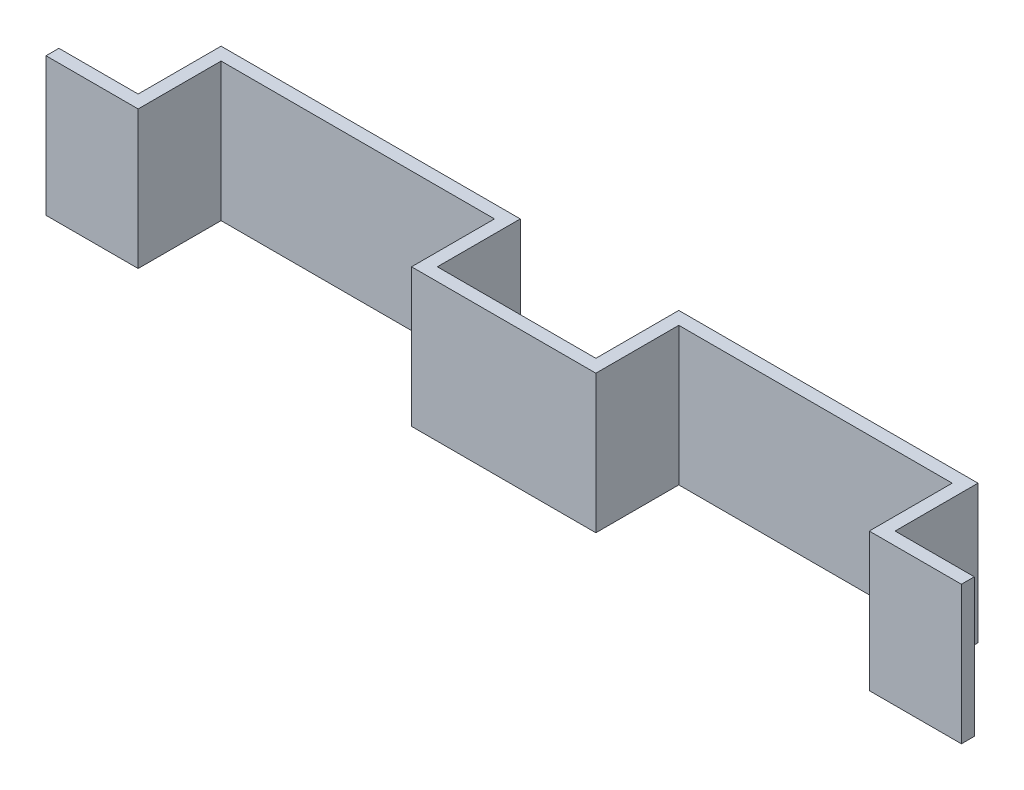
ISO-10303-21;
HEADER;
FILE_DESCRIPTION(('STEP AP214'),'2;1');
FILE_NAME('part.step','',(''),(''),'','','');
FILE_SCHEMA(('AUTOMOTIVE_DESIGN { 1 0 10303 214 1 1 1 1 }'));
ENDSEC;
DATA;
#1=APPLICATION_CONTEXT('core data for automotive mechanical design processes');
#2=APPLICATION_PROTOCOL_DEFINITION('international standard','automotive_design',2000,#1);
#3=PRODUCT_CONTEXT('',#1,'mechanical');
#4=PRODUCT('Part','Part','',(#3));
#5=PRODUCT_RELATED_PRODUCT_CATEGORY('part','',(#4));
#6=PRODUCT_DEFINITION_FORMATION('','',#4);
#7=PRODUCT_DEFINITION_CONTEXT('part definition',#1,'design');
#8=PRODUCT_DEFINITION('design','',#6,#7);
#9=PRODUCT_DEFINITION_SHAPE('','',#8);
#10=(LENGTH_UNIT() NAMED_UNIT(*) SI_UNIT(.MILLI.,.METRE.));
#11=(NAMED_UNIT(*) PLANE_ANGLE_UNIT() SI_UNIT($,.RADIAN.));
#12=(NAMED_UNIT(*) SI_UNIT($,.STERADIAN.) SOLID_ANGLE_UNIT());
#13=UNCERTAINTY_MEASURE_WITH_UNIT(LENGTH_MEASURE(1.E-05),#10,'distance_accuracy_value','');
#14=(GEOMETRIC_REPRESENTATION_CONTEXT(3) GLOBAL_UNCERTAINTY_ASSIGNED_CONTEXT((#13)) GLOBAL_UNIT_ASSIGNED_CONTEXT((#10,
#11,#12)) REPRESENTATION_CONTEXT('',''));
#15=CARTESIAN_POINT('',(0.,0.,0.));
#16=DIRECTION('',(0.,0.,1.));
#17=DIRECTION('',(1.,0.,0.));
#18=AXIS2_PLACEMENT_3D('',#15,#16,#17);
#19=CARTESIAN_POINT('',(0.,15.,0.));
#20=DIRECTION('',(0.,0.,-1.));
#21=DIRECTION('',(-1.,0.,0.));
#22=AXIS2_PLACEMENT_3D('',#19,#20,#21);
#23=PLANE('',#22);
#24=DIRECTION('',(1.,0.,0.));
#25=VECTOR('',#24,1.);
#26=CARTESIAN_POINT('',(0.,0.,0.));
#27=LINE('',#26,#25);
#28=CARTESIAN_POINT('',(-32.4699999999999,0.,0.));
#29=VERTEX_POINT('',#28);
#30=CARTESIAN_POINT('',(0.,0.,0.));
#31=VERTEX_POINT('',#30);
#32=EDGE_CURVE('E206',#29,#31,#27,.T.);
#33=ORIENTED_EDGE('',*,*,#32,.F.);
#34=DIRECTION('',(0.,-1.,0.));
#35=VECTOR('',#34,1.);
#36=CARTESIAN_POINT('',(-32.4699999999999,15.,0.));
#37=LINE('',#36,#35);
#38=CARTESIAN_POINT('',(-32.4699999999999,15.,0.));
#39=VERTEX_POINT('',#38);
#40=EDGE_CURVE('E11',#39,#29,#37,.T.);
#41=ORIENTED_EDGE('',*,*,#40,.F.);
#42=DIRECTION('',(1.,0.,0.));
#43=VECTOR('',#42,1.);
#44=CARTESIAN_POINT('',(0.,15.,0.));
#45=LINE('',#44,#43);
#46=CARTESIAN_POINT('',(0.,15.,0.));
#47=VERTEX_POINT('',#46);
#48=EDGE_CURVE('E265',#39,#47,#45,.T.);
#49=ORIENTED_EDGE('',*,*,#48,.T.);
#50=DIRECTION('',(0.,-1.,0.));
#51=VECTOR('',#50,1.);
#52=CARTESIAN_POINT('',(0.,15.,0.));
#53=LINE('',#52,#51);
#54=EDGE_CURVE('E60',#47,#31,#53,.T.);
#55=ORIENTED_EDGE('',*,*,#54,.T.);
#56=EDGE_LOOP('',(#33,#41,#49,#55));
#57=FACE_BOUND('',#56,.T.);
#58=ADVANCED_FACE('F41',(#57),#23,.T.);
#59=CARTESIAN_POINT('',(-32.4699999999999,15.,1.7523791060211E-13));
#60=DIRECTION('',(-1.,0.,0.));
#61=DIRECTION('',(0.,0.,1.));
#62=AXIS2_PLACEMENT_3D('',#59,#60,#61);
#63=PLANE('',#62);
#64=DIRECTION('',(0.,0.,-1.));
#65=VECTOR('',#64,1.);
#66=CARTESIAN_POINT('',(-32.4699999999999,0.,1.7523791060211E-13));
#67=LINE('',#66,#65);
#68=CARTESIAN_POINT('',(-32.4699999999999,0.,9.00000000000046));
#69=VERTEX_POINT('',#68);
#70=EDGE_CURVE('E208',#69,#29,#67,.T.);
#71=ORIENTED_EDGE('',*,*,#70,.F.);
#72=DIRECTION('',(0.,-1.,0.));
#73=VECTOR('',#72,1.);
#74=CARTESIAN_POINT('',(-32.4699999999999,15.,9.00000000000046));
#75=LINE('',#74,#73);
#76=CARTESIAN_POINT('',(-32.4699999999999,15.,9.00000000000046));
#77=VERTEX_POINT('',#76);
#78=EDGE_CURVE('E47',#77,#69,#75,.T.);
#79=ORIENTED_EDGE('',*,*,#78,.F.);
#80=DIRECTION('',(0.,0.,-1.));
#81=VECTOR('',#80,1.);
#82=CARTESIAN_POINT('',(-32.4699999999999,15.,1.7523791060211E-13));
#83=LINE('',#82,#81);
#84=EDGE_CURVE('E312',#77,#39,#83,.T.);
#85=ORIENTED_EDGE('',*,*,#84,.T.);
#86=ORIENTED_EDGE('',*,*,#40,.T.);
#87=EDGE_LOOP('',(#71,#79,#85,#86));
#88=FACE_BOUND('',#87,.T.);
#89=ADVANCED_FACE('F302',(#88),#63,.T.);
#90=CARTESIAN_POINT('',(1.27078580216906E-13,15.,9.));
#91=DIRECTION('',(0.,0.,-1.));
#92=DIRECTION('',(-1.,0.,0.));
#93=AXIS2_PLACEMENT_3D('',#90,#91,#92);
#94=PLANE('',#93);
#95=DIRECTION('',(1.,0.,0.));
#96=VECTOR('',#95,1.);
#97=CARTESIAN_POINT('',(1.27078580216906E-13,0.,9.));
#98=LINE('',#97,#96);
#99=CARTESIAN_POINT('',(-49.6699999999999,0.,9.00000000000069));
#100=VERTEX_POINT('',#99);
#101=EDGE_CURVE('E211',#100,#69,#98,.T.);
#102=ORIENTED_EDGE('',*,*,#101,.F.);
#103=DIRECTION('',(0.,-1.,0.));
#104=VECTOR('',#103,1.);
#105=CARTESIAN_POINT('',(-49.6699999999999,15.,9.00000000000069));
#106=LINE('',#105,#104);
#107=CARTESIAN_POINT('',(-49.6699999999999,15.,9.00000000000069));
#108=VERTEX_POINT('',#107);
#109=EDGE_CURVE('E295',#108,#100,#106,.T.);
#110=ORIENTED_EDGE('',*,*,#109,.F.);
#111=DIRECTION('',(1.,0.,0.));
#112=VECTOR('',#111,1.);
#113=CARTESIAN_POINT('',(1.27078580216906E-13,15.,9.));
#114=LINE('',#113,#112);
#115=EDGE_CURVE('E298',#108,#77,#114,.T.);
#116=ORIENTED_EDGE('',*,*,#115,.T.);
#117=ORIENTED_EDGE('',*,*,#78,.T.);
#118=EDGE_LOOP('',(#102,#110,#116,#117));
#119=FACE_BOUND('',#118,.T.);
#120=ADVANCED_FACE('F296',(#119),#94,.T.);
#121=CARTESIAN_POINT('',(-49.67,15.,3.0635987573962E-13));
#122=DIRECTION('',(1.,0.,0.));
#123=DIRECTION('',(0.,0.,-1.));
#124=AXIS2_PLACEMENT_3D('',#121,#122,#123);
#125=PLANE('',#124);
#126=DIRECTION('',(0.,0.,1.));
#127=VECTOR('',#126,1.);
#128=CARTESIAN_POINT('',(-49.67,0.,3.0635987573962E-13));
#129=LINE('',#128,#127);
#130=CARTESIAN_POINT('',(-49.67,0.,6.9368751520493E-13));
#131=VERTEX_POINT('',#130);
#132=EDGE_CURVE('E212',#131,#100,#129,.T.);
#133=ORIENTED_EDGE('',*,*,#132,.F.);
#134=DIRECTION('',(0.,-1.,0.));
#135=VECTOR('',#134,1.);
#136=CARTESIAN_POINT('',(-49.67,15.,6.9368751520493E-13));
#137=LINE('',#136,#135);
#138=CARTESIAN_POINT('',(-49.67,15.,6.9368751520493E-13));
#139=VERTEX_POINT('',#138);
#140=EDGE_CURVE('E289',#139,#131,#137,.T.);
#141=ORIENTED_EDGE('',*,*,#140,.F.);
#142=DIRECTION('',(0.,0.,1.));
#143=VECTOR('',#142,1.);
#144=CARTESIAN_POINT('',(-49.67,15.,3.0635987573962E-13));
#145=LINE('',#144,#143);
#146=EDGE_CURVE('E315',#139,#108,#145,.T.);
#147=ORIENTED_EDGE('',*,*,#146,.T.);
#148=ORIENTED_EDGE('',*,*,#109,.T.);
#149=EDGE_LOOP('',(#133,#141,#147,#148));
#150=FACE_BOUND('',#149,.T.);
#151=ADVANCED_FACE('F310',(#150),#125,.T.);
#152=CARTESIAN_POINT('',(0.,15.,7.41453045845511E-13));
#153=DIRECTION('',(0.,0.,-1.));
#154=DIRECTION('',(-1.,0.,0.));
#155=AXIS2_PLACEMENT_3D('',#152,#153,#154);
#156=PLANE('',#155);
#157=DIRECTION('',(1.,0.,0.));
#158=VECTOR('',#157,1.);
#159=CARTESIAN_POINT('',(0.,0.,7.41453045845511E-13));
#160=LINE('',#159,#158);
#161=CARTESIAN_POINT('',(-82.1399999999999,0.,6.62462489833772E-13));
#162=VERTEX_POINT('',#161);
#163=EDGE_CURVE('E220',#162,#131,#160,.T.);
#164=ORIENTED_EDGE('',*,*,#163,.F.);
#165=DIRECTION('',(0.,-1.,0.));
#166=VECTOR('',#165,1.);
#167=CARTESIAN_POINT('',(-82.1399999999999,15.,6.62462489833772E-13));
#168=LINE('',#167,#166);
#169=CARTESIAN_POINT('',(-82.1399999999999,15.,6.62462489833772E-13));
#170=VERTEX_POINT('',#169);
#171=EDGE_CURVE('E287',#170,#162,#168,.T.);
#172=ORIENTED_EDGE('',*,*,#171,.F.);
#173=DIRECTION('',(1.,0.,0.));
#174=VECTOR('',#173,1.);
#175=CARTESIAN_POINT('',(0.,15.,7.41453045845511E-13));
#176=LINE('',#175,#174);
#177=EDGE_CURVE('E320',#170,#139,#176,.T.);
#178=ORIENTED_EDGE('',*,*,#177,.T.);
#179=ORIENTED_EDGE('',*,*,#140,.T.);
#180=EDGE_LOOP('',(#164,#172,#178,#179));
#181=FACE_BOUND('',#180,.T.);
#182=ADVANCED_FACE('F379',(#181),#156,.T.);
#183=CARTESIAN_POINT('',(-82.1399999999999,15.,-1.26657943392646E-13));
#184=DIRECTION('',(-1.,0.,0.));
#185=DIRECTION('',(0.,0.,1.));
#186=AXIS2_PLACEMENT_3D('',#183,#184,#185);
#187=PLANE('',#186);
#188=DIRECTION('',(0.,0.,-1.));
#189=VECTOR('',#188,1.);
#190=CARTESIAN_POINT('',(-82.1399999999999,0.,-1.26657943392646E-13));
#191=LINE('',#190,#189);
#192=CARTESIAN_POINT('',(-82.1399999999999,0.,9.00000000000115));
#193=VERTEX_POINT('',#192);
#194=EDGE_CURVE('E219',#193,#162,#191,.T.);
#195=ORIENTED_EDGE('',*,*,#194,.F.);
#196=DIRECTION('',(0.,-1.,0.));
#197=VECTOR('',#196,1.);
#198=CARTESIAN_POINT('',(-82.1399999999999,15.,9.00000000000115));
#199=LINE('',#198,#197);
#200=CARTESIAN_POINT('',(-82.1399999999999,15.,9.00000000000115));
#201=VERTEX_POINT('',#200);
#202=EDGE_CURVE('E286',#201,#193,#199,.T.);
#203=ORIENTED_EDGE('',*,*,#202,.F.);
#204=DIRECTION('',(0.,0.,-1.));
#205=VECTOR('',#204,1.);
#206=CARTESIAN_POINT('',(-82.1399999999999,15.,-1.26657943392646E-13));
#207=LINE('',#206,#205);
#208=EDGE_CURVE('E323',#201,#170,#207,.T.);
#209=ORIENTED_EDGE('',*,*,#208,.T.);
#210=ORIENTED_EDGE('',*,*,#171,.T.);
#211=EDGE_LOOP('',(#195,#203,#209,#210));
#212=FACE_BOUND('',#211,.T.);
#213=ADVANCED_FACE('F382',(#212),#187,.T.);
#214=CARTESIAN_POINT('',(1.27078580216906E-13,15.,8.99999999999999));
#215=DIRECTION('',(0.,0.,-1.));
#216=DIRECTION('',(-1.,0.,0.));
#217=AXIS2_PLACEMENT_3D('',#214,#215,#216);
#218=PLANE('',#217);
#219=DIRECTION('',(1.,0.,0.));
#220=VECTOR('',#219,1.);
#221=CARTESIAN_POINT('',(1.27078580216906E-13,0.,8.99999999999999));
#222=LINE('',#221,#220);
#223=CARTESIAN_POINT('',(-90.7399999999999,0.,9.00000000000127));
#224=VERTEX_POINT('',#223);
#225=EDGE_CURVE('E224',#224,#193,#222,.T.);
#226=ORIENTED_EDGE('',*,*,#225,.F.);
#227=DIRECTION('',(0.,-1.,0.));
#228=VECTOR('',#227,1.);
#229=CARTESIAN_POINT('',(-90.7399999999999,15.,9.00000000000127));
#230=LINE('',#229,#228);
#231=CARTESIAN_POINT('',(-90.7399999999999,15.,9.00000000000127));
#232=VERTEX_POINT('',#231);
#233=EDGE_CURVE('E283',#232,#224,#230,.T.);
#234=ORIENTED_EDGE('',*,*,#233,.F.);
#235=DIRECTION('',(1.,0.,0.));
#236=VECTOR('',#235,1.);
#237=CARTESIAN_POINT('',(1.27078580216906E-13,15.,8.99999999999999));
#238=LINE('',#237,#236);
#239=EDGE_CURVE('E326',#232,#201,#238,.T.);
#240=ORIENTED_EDGE('',*,*,#239,.T.);
#241=ORIENTED_EDGE('',*,*,#202,.T.);
#242=EDGE_LOOP('',(#226,#234,#240,#241));
#243=FACE_BOUND('',#242,.T.);
#244=ADVANCED_FACE('F390',(#243),#218,.T.);
#245=CARTESIAN_POINT('',(-90.7399999999999,15.,0.));
#246=DIRECTION('',(-1.,0.,0.));
#247=DIRECTION('',(0.,0.,1.));
#248=AXIS2_PLACEMENT_3D('',#245,#246,#247);
#249=PLANE('',#248);
#250=DIRECTION('',(0.,0.,-1.));
#251=VECTOR('',#250,1.);
#252=CARTESIAN_POINT('',(-90.7399999999999,0.,0.));
#253=LINE('',#252,#251);
#254=CARTESIAN_POINT('',(-90.7399999999999,0.,10.4000000000013));
#255=VERTEX_POINT('',#254);
#256=EDGE_CURVE('E229',#255,#224,#253,.T.);
#257=ORIENTED_EDGE('',*,*,#256,.F.);
#258=DIRECTION('',(0.,-1.,0.));
#259=VECTOR('',#258,1.);
#260=CARTESIAN_POINT('',(-90.7399999999999,15.,10.4000000000013));
#261=LINE('',#260,#259);
#262=CARTESIAN_POINT('',(-90.7399999999999,15.,10.4000000000013));
#263=VERTEX_POINT('',#262);
#264=EDGE_CURVE('E281',#263,#255,#261,.T.);
#265=ORIENTED_EDGE('',*,*,#264,.F.);
#266=DIRECTION('',(0.,0.,-1.));
#267=VECTOR('',#266,1.);
#268=CARTESIAN_POINT('',(-90.7399999999999,15.,0.));
#269=LINE('',#268,#267);
#270=EDGE_CURVE('E328',#263,#232,#269,.T.);
#271=ORIENTED_EDGE('',*,*,#270,.T.);
#272=ORIENTED_EDGE('',*,*,#233,.T.);
#273=EDGE_LOOP('',(#257,#265,#271,#272));
#274=FACE_BOUND('',#273,.T.);
#275=ADVANCED_FACE('F394',(#274),#249,.T.);
#276=CARTESIAN_POINT('',(1.46133105616286E-13,15.,10.4));
#277=DIRECTION('',(0.,0.,1.));
#278=DIRECTION('',(1.,0.,0.));
#279=AXIS2_PLACEMENT_3D('',#276,#277,#278);
#280=PLANE('',#279);
#281=DIRECTION('',(-1.,0.,0.));
#282=VECTOR('',#281,1.);
#283=CARTESIAN_POINT('',(1.46133105616286E-13,0.,10.4));
#284=LINE('',#283,#282);
#285=CARTESIAN_POINT('',(-80.7399999999999,0.,10.4000000000011));
#286=VERTEX_POINT('',#285);
#287=EDGE_CURVE('E228',#286,#255,#284,.T.);
#288=ORIENTED_EDGE('',*,*,#287,.F.);
#289=DIRECTION('',(0.,-1.,0.));
#290=VECTOR('',#289,1.);
#291=CARTESIAN_POINT('',(-80.7399999999999,15.,10.4000000000011));
#292=LINE('',#291,#290);
#293=CARTESIAN_POINT('',(-80.7399999999999,15.,10.4000000000011));
#294=VERTEX_POINT('',#293);
#295=EDGE_CURVE('E278',#294,#286,#292,.T.);
#296=ORIENTED_EDGE('',*,*,#295,.F.);
#297=DIRECTION('',(-1.,0.,0.));
#298=VECTOR('',#297,1.);
#299=CARTESIAN_POINT('',(1.46133105616286E-13,15.,10.4));
#300=LINE('',#299,#298);
#301=EDGE_CURVE('E335',#294,#263,#300,.T.);
#302=ORIENTED_EDGE('',*,*,#301,.T.);
#303=ORIENTED_EDGE('',*,*,#264,.T.);
#304=EDGE_LOOP('',(#288,#296,#302,#303));
#305=FACE_BOUND('',#304,.T.);
#306=ADVANCED_FACE('F392',(#305),#280,.T.);
#307=CARTESIAN_POINT('',(-80.7400000000001,15.,1.49399011680385E-12));
#308=DIRECTION('',(1.,0.,0.));
#309=DIRECTION('',(0.,0.,-1.));
#310=AXIS2_PLACEMENT_3D('',#307,#308,#309);
#311=PLANE('',#310);
#312=DIRECTION('',(0.,0.,1.));
#313=VECTOR('',#312,1.);
#314=CARTESIAN_POINT('',(-80.7400000000001,0.,1.49399011680385E-12));
#315=LINE('',#314,#313);
#316=CARTESIAN_POINT('',(-80.74,0.,1.4000000000007));
#317=VERTEX_POINT('',#316);
#318=EDGE_CURVE('E235',#317,#286,#315,.T.);
#319=ORIENTED_EDGE('',*,*,#318,.F.);
#320=DIRECTION('',(0.,-1.,0.));
#321=VECTOR('',#320,1.);
#322=CARTESIAN_POINT('',(-80.74,15.,1.4000000000007));
#323=LINE('',#322,#321);
#324=CARTESIAN_POINT('',(-80.74,15.,1.4000000000007));
#325=VERTEX_POINT('',#324);
#326=EDGE_CURVE('E279',#325,#317,#323,.T.);
#327=ORIENTED_EDGE('',*,*,#326,.F.);
#328=DIRECTION('',(0.,0.,1.));
#329=VECTOR('',#328,1.);
#330=CARTESIAN_POINT('',(-80.7400000000001,15.,1.49399011680385E-12));
#331=LINE('',#330,#329);
#332=EDGE_CURVE('E333',#325,#294,#331,.T.);
#333=ORIENTED_EDGE('',*,*,#332,.T.);
#334=ORIENTED_EDGE('',*,*,#295,.T.);
#335=EDGE_LOOP('',(#319,#327,#333,#334));
#336=FACE_BOUND('',#335,.T.);
#337=ADVANCED_FACE('F398',(#336),#311,.T.);
#338=CARTESIAN_POINT('',(0.,15.,1.4000000000007));
#339=DIRECTION('',(0.,0.,1.));
#340=DIRECTION('',(1.,0.,0.));
#341=AXIS2_PLACEMENT_3D('',#338,#339,#340);
#342=PLANE('',#341);
#343=DIRECTION('',(-1.,0.,0.));
#344=VECTOR('',#343,1.);
#345=CARTESIAN_POINT('',(0.,0.,1.4000000000007));
#346=LINE('',#345,#344);
#347=CARTESIAN_POINT('',(-51.0700000000001,0.,1.4000000000007));
#348=VERTEX_POINT('',#347);
#349=EDGE_CURVE('E234',#348,#317,#346,.T.);
#350=ORIENTED_EDGE('',*,*,#349,.F.);
#351=DIRECTION('',(0.,-1.,0.));
#352=VECTOR('',#351,1.);
#353=CARTESIAN_POINT('',(-51.0700000000001,15.,1.4000000000007));
#354=LINE('',#353,#352);
#355=CARTESIAN_POINT('',(-51.0700000000001,15.,1.4000000000007));
#356=VERTEX_POINT('',#355);
#357=EDGE_CURVE('E277',#356,#348,#354,.T.);
#358=ORIENTED_EDGE('',*,*,#357,.F.);
#359=DIRECTION('',(-1.,0.,0.));
#360=VECTOR('',#359,1.);
#361=CARTESIAN_POINT('',(0.,15.,1.4000000000007));
#362=LINE('',#361,#360);
#363=EDGE_CURVE('E340',#356,#325,#362,.T.);
#364=ORIENTED_EDGE('',*,*,#363,.T.);
#365=ORIENTED_EDGE('',*,*,#326,.T.);
#366=EDGE_LOOP('',(#350,#358,#364,#365));
#367=FACE_BOUND('',#366,.T.);
#368=ADVANCED_FACE('F401',(#367),#342,.T.);
#369=CARTESIAN_POINT('',(-51.0700000000001,15.,1.06310793501763E-12));
#370=DIRECTION('',(-1.,0.,0.));
#371=DIRECTION('',(0.,0.,1.));
#372=AXIS2_PLACEMENT_3D('',#369,#370,#371);
#373=PLANE('',#372);
#374=DIRECTION('',(0.,0.,-1.));
#375=VECTOR('',#374,1.);
#376=CARTESIAN_POINT('',(-51.0700000000001,0.,1.06310793501763E-12));
#377=LINE('',#376,#375);
#378=CARTESIAN_POINT('',(-51.0699999999999,0.,10.4000000000007));
#379=VERTEX_POINT('',#378);
#380=EDGE_CURVE('E236',#379,#348,#377,.T.);
#381=ORIENTED_EDGE('',*,*,#380,.F.);
#382=DIRECTION('',(0.,-1.,0.));
#383=VECTOR('',#382,1.);
#384=CARTESIAN_POINT('',(-51.0699999999999,15.,10.4000000000007));
#385=LINE('',#384,#383);
#386=CARTESIAN_POINT('',(-51.0699999999999,15.,10.4000000000007));
#387=VERTEX_POINT('',#386);
#388=EDGE_CURVE('E273',#387,#379,#385,.T.);
#389=ORIENTED_EDGE('',*,*,#388,.F.);
#390=DIRECTION('',(0.,0.,-1.));
#391=VECTOR('',#390,1.);
#392=CARTESIAN_POINT('',(-51.0700000000001,15.,1.06310793501763E-12));
#393=LINE('',#392,#391);
#394=EDGE_CURVE('E341',#387,#356,#393,.T.);
#395=ORIENTED_EDGE('',*,*,#394,.T.);
#396=ORIENTED_EDGE('',*,*,#357,.T.);
#397=EDGE_LOOP('',(#381,#389,#395,#396));
#398=FACE_BOUND('',#397,.T.);
#399=ADVANCED_FACE('F406',(#398),#373,.T.);
#400=CARTESIAN_POINT('',(1.46133105616286E-13,15.,10.4));
#401=DIRECTION('',(0.,0.,1.));
#402=DIRECTION('',(1.,0.,0.));
#403=AXIS2_PLACEMENT_3D('',#400,#401,#402);
#404=PLANE('',#403);
#405=DIRECTION('',(-1.,0.,0.));
#406=VECTOR('',#405,1.);
#407=CARTESIAN_POINT('',(1.46133105616286E-13,0.,10.4));
#408=LINE('',#407,#406);
#409=CARTESIAN_POINT('',(-31.0699999999999,0.,10.4000000000004));
#410=VERTEX_POINT('',#409);
#411=EDGE_CURVE('E244',#410,#379,#408,.T.);
#412=ORIENTED_EDGE('',*,*,#411,.F.);
#413=DIRECTION('',(0.,-1.,0.));
#414=VECTOR('',#413,1.);
#415=CARTESIAN_POINT('',(-31.0699999999999,15.,10.4000000000004));
#416=LINE('',#415,#414);
#417=CARTESIAN_POINT('',(-31.0699999999999,15.,10.4000000000004));
#418=VERTEX_POINT('',#417);
#419=EDGE_CURVE('E275',#418,#410,#416,.T.);
#420=ORIENTED_EDGE('',*,*,#419,.F.);
#421=DIRECTION('',(-1.,0.,0.));
#422=VECTOR('',#421,1.);
#423=CARTESIAN_POINT('',(1.46133105616286E-13,15.,10.4));
#424=LINE('',#423,#422);
#425=EDGE_CURVE('E343',#418,#387,#424,.T.);
#426=ORIENTED_EDGE('',*,*,#425,.T.);
#427=ORIENTED_EDGE('',*,*,#388,.T.);
#428=EDGE_LOOP('',(#412,#420,#426,#427));
#429=FACE_BOUND('',#428,.T.);
#430=ADVANCED_FACE('F411',(#429),#404,.T.);
#431=CARTESIAN_POINT('',(-31.0700000000001,15.,5.86887791451389E-13));
#432=DIRECTION('',(1.,0.,0.));
#433=DIRECTION('',(0.,0.,-1.));
#434=AXIS2_PLACEMENT_3D('',#431,#432,#433);
#435=PLANE('',#434);
#436=DIRECTION('',(0.,0.,1.));
#437=VECTOR('',#436,1.);
#438=CARTESIAN_POINT('',(-31.0700000000001,0.,5.86887791451389E-13));
#439=LINE('',#438,#437);
#440=CARTESIAN_POINT('',(-31.07,0.,1.4));
#441=VERTEX_POINT('',#440);
#442=EDGE_CURVE('E243',#441,#410,#439,.T.);
#443=ORIENTED_EDGE('',*,*,#442,.F.);
#444=DIRECTION('',(0.,-1.,0.));
#445=VECTOR('',#444,1.);
#446=CARTESIAN_POINT('',(-31.07,15.,1.4));
#447=LINE('',#446,#445);
#448=CARTESIAN_POINT('',(-31.07,15.,1.4));
#449=VERTEX_POINT('',#448);
#450=EDGE_CURVE('E269',#449,#441,#447,.T.);
#451=ORIENTED_EDGE('',*,*,#450,.F.);
#452=DIRECTION('',(0.,0.,1.));
#453=VECTOR('',#452,1.);
#454=CARTESIAN_POINT('',(-31.0700000000001,15.,5.86887791451389E-13));
#455=LINE('',#454,#453);
#456=EDGE_CURVE('E350',#449,#418,#455,.T.);
#457=ORIENTED_EDGE('',*,*,#456,.T.);
#458=ORIENTED_EDGE('',*,*,#419,.T.);
#459=EDGE_LOOP('',(#443,#451,#457,#458));
#460=FACE_BOUND('',#459,.T.);
#461=ADVANCED_FACE('F414',(#460),#435,.T.);
#462=CARTESIAN_POINT('',(0.,15.,1.4));
#463=DIRECTION('',(0.,0.,1.));
#464=DIRECTION('',(1.,0.,0.));
#465=AXIS2_PLACEMENT_3D('',#462,#463,#464);
#466=PLANE('',#465);
#467=DIRECTION('',(-1.,0.,0.));
#468=VECTOR('',#467,1.);
#469=CARTESIAN_POINT('',(0.,0.,1.4));
#470=LINE('',#469,#468);
#471=CARTESIAN_POINT('',(-1.39999999999998,0.,1.4));
#472=VERTEX_POINT('',#471);
#473=EDGE_CURVE('E250',#472,#441,#470,.T.);
#474=ORIENTED_EDGE('',*,*,#473,.F.);
#475=DIRECTION('',(0.,-1.,0.));
#476=VECTOR('',#475,1.);
#477=CARTESIAN_POINT('',(-1.39999999999998,15.,1.4));
#478=LINE('',#477,#476);
#479=CARTESIAN_POINT('',(-1.39999999999998,15.,1.4));
#480=VERTEX_POINT('',#479);
#481=EDGE_CURVE('E268',#480,#472,#478,.T.);
#482=ORIENTED_EDGE('',*,*,#481,.F.);
#483=DIRECTION('',(-1.,0.,0.));
#484=VECTOR('',#483,1.);
#485=CARTESIAN_POINT('',(0.,15.,1.4));
#486=LINE('',#485,#484);
#487=EDGE_CURVE('E348',#480,#449,#486,.T.);
#488=ORIENTED_EDGE('',*,*,#487,.T.);
#489=ORIENTED_EDGE('',*,*,#450,.T.);
#490=EDGE_LOOP('',(#474,#482,#488,#489));
#491=FACE_BOUND('',#490,.T.);
#492=ADVANCED_FACE('F420',(#491),#466,.T.);
#493=CARTESIAN_POINT('',(-1.4,15.,0.));
#494=DIRECTION('',(-1.,0.,0.));
#495=DIRECTION('',(0.,0.,1.));
#496=AXIS2_PLACEMENT_3D('',#493,#494,#495);
#497=PLANE('',#496);
#498=DIRECTION('',(0.,0.,-1.));
#499=VECTOR('',#498,1.);
#500=CARTESIAN_POINT('',(-1.4,0.,0.));
#501=LINE('',#500,#499);
#502=CARTESIAN_POINT('',(-1.39999999999987,0.,10.4));
#503=VERTEX_POINT('',#502);
#504=EDGE_CURVE('E249',#503,#472,#501,.T.);
#505=ORIENTED_EDGE('',*,*,#504,.F.);
#506=DIRECTION('',(0.,-1.,0.));
#507=VECTOR('',#506,1.);
#508=CARTESIAN_POINT('',(-1.39999999999987,15.,10.4));
#509=LINE('',#508,#507);
#510=CARTESIAN_POINT('',(-1.39999999999987,15.,10.4));
#511=VERTEX_POINT('',#510);
#512=EDGE_CURVE('E266',#511,#503,#509,.T.);
#513=ORIENTED_EDGE('',*,*,#512,.F.);
#514=DIRECTION('',(0.,0.,-1.));
#515=VECTOR('',#514,1.);
#516=CARTESIAN_POINT('',(-1.4,15.,0.));
#517=LINE('',#516,#515);
#518=EDGE_CURVE('E355',#511,#480,#517,.T.);
#519=ORIENTED_EDGE('',*,*,#518,.T.);
#520=ORIENTED_EDGE('',*,*,#481,.T.);
#521=EDGE_LOOP('',(#505,#513,#519,#520));
#522=FACE_BOUND('',#521,.T.);
#523=ADVANCED_FACE('F421',(#522),#497,.T.);
#524=CARTESIAN_POINT('',(1.4432899320127E-13,15.,10.4));
#525=DIRECTION('',(0.,0.,1.));
#526=DIRECTION('',(1.,0.,0.));
#527=AXIS2_PLACEMENT_3D('',#524,#525,#526);
#528=PLANE('',#527);
#529=DIRECTION('',(-1.,0.,0.));
#530=VECTOR('',#529,1.);
#531=CARTESIAN_POINT('',(1.4432899320127E-13,0.,10.4));
#532=LINE('',#531,#530);
#533=CARTESIAN_POINT('',(8.60000000000013,0.,10.3999999999999));
#534=VERTEX_POINT('',#533);
#535=EDGE_CURVE('E251',#534,#503,#532,.T.);
#536=ORIENTED_EDGE('',*,*,#535,.F.);
#537=DIRECTION('',(0.,-1.,0.));
#538=VECTOR('',#537,1.);
#539=CARTESIAN_POINT('',(8.60000000000013,15.,10.3999999999999));
#540=LINE('',#539,#538);
#541=CARTESIAN_POINT('',(8.60000000000013,15.,10.3999999999999));
#542=VERTEX_POINT('',#541);
#543=EDGE_CURVE('E190',#542,#534,#540,.T.);
#544=ORIENTED_EDGE('',*,*,#543,.F.);
#545=DIRECTION('',(-1.,0.,0.));
#546=VECTOR('',#545,1.);
#547=CARTESIAN_POINT('',(1.4432899320127E-13,15.,10.4));
#548=LINE('',#547,#546);
#549=EDGE_CURVE('E196',#542,#511,#548,.T.);
#550=ORIENTED_EDGE('',*,*,#549,.T.);
#551=ORIENTED_EDGE('',*,*,#512,.T.);
#552=EDGE_LOOP('',(#536,#544,#550,#551));
#553=FACE_BOUND('',#552,.T.);
#554=ADVANCED_FACE('F360',(#553),#528,.T.);
#555=CARTESIAN_POINT('',(8.59999999999925,15.,-7.24618777680285E-13));
#556=DIRECTION('',(1.,0.,0.));
#557=DIRECTION('',(0.,0.,-1.));
#558=AXIS2_PLACEMENT_3D('',#555,#556,#557);
#559=PLANE('',#558);
#560=DIRECTION('',(0.,0.,1.));
#561=VECTOR('',#560,1.);
#562=CARTESIAN_POINT('',(8.59999999999925,0.,-7.24618777680285E-13));
#563=LINE('',#562,#561);
#564=CARTESIAN_POINT('',(8.60000000000001,0.,9.00000000000161));
#565=VERTEX_POINT('',#564);
#566=EDGE_CURVE('E184',#565,#534,#563,.T.);
#567=ORIENTED_EDGE('',*,*,#566,.F.);
#568=DIRECTION('',(0.,-1.,0.));
#569=VECTOR('',#568,1.);
#570=CARTESIAN_POINT('',(8.60000000000001,15.,9.00000000000161));
#571=LINE('',#570,#569);
#572=CARTESIAN_POINT('',(8.60000000000001,15.,9.00000000000161));
#573=VERTEX_POINT('',#572);
#574=EDGE_CURVE('E178',#573,#565,#571,.T.);
#575=ORIENTED_EDGE('',*,*,#574,.F.);
#576=DIRECTION('',(0.,0.,1.));
#577=VECTOR('',#576,1.);
#578=CARTESIAN_POINT('',(8.59999999999925,15.,-7.24618777680285E-13));
#579=LINE('',#578,#577);
#580=EDGE_CURVE('E185',#573,#542,#579,.T.);
#581=ORIENTED_EDGE('',*,*,#580,.T.);
#582=ORIENTED_EDGE('',*,*,#543,.T.);
#583=EDGE_LOOP('',(#567,#575,#581,#582));
#584=FACE_BOUND('',#583,.T.);
#585=ADVANCED_FACE('F182',(#584),#559,.T.);
#586=CARTESIAN_POINT('',(-1.68651430030724E-12,15.,9.));
#587=DIRECTION('',(1.87390477811915E-13,0.,-1.));
#588=DIRECTION('',(-1.,0.,-1.87390477811915E-13));
#589=AXIS2_PLACEMENT_3D('',#586,#587,#588);
#590=PLANE('',#589);
#591=DIRECTION('',(1.,0.,1.87390477811915E-13));
#592=VECTOR('',#591,1.);
#593=CARTESIAN_POINT('',(-1.68651430030724E-12,0.,9.));
#594=LINE('',#593,#592);
#595=CARTESIAN_POINT('',(0.,0.,9.));
#596=VERTEX_POINT('',#595);
#597=EDGE_CURVE('E260',#596,#565,#594,.T.);
#598=ORIENTED_EDGE('',*,*,#597,.F.);
#599=DIRECTION('',(0.,-1.,0.));
#600=VECTOR('',#599,1.);
#601=CARTESIAN_POINT('',(0.,15.,9.));
#602=LINE('',#601,#600);
#603=CARTESIAN_POINT('',(0.,15.,9.));
#604=VERTEX_POINT('',#603);
#605=EDGE_CURVE('E120',#604,#596,#602,.T.);
#606=ORIENTED_EDGE('',*,*,#605,.F.);
#607=DIRECTION('',(1.,0.,1.87390477811915E-13));
#608=VECTOR('',#607,1.);
#609=CARTESIAN_POINT('',(-1.68651430030724E-12,15.,9.));
#610=LINE('',#609,#608);
#611=EDGE_CURVE('E194',#604,#573,#610,.T.);
#612=ORIENTED_EDGE('',*,*,#611,.T.);
#613=ORIENTED_EDGE('',*,*,#574,.T.);
#614=EDGE_LOOP('',(#598,#606,#612,#613));
#615=FACE_BOUND('',#614,.T.);
#616=ADVANCED_FACE('F199',(#615),#590,.T.);
#617=CARTESIAN_POINT('',(0.,15.,0.));
#618=DIRECTION('',(1.,0.,0.));
#619=DIRECTION('',(0.,0.,-1.));
#620=AXIS2_PLACEMENT_3D('',#617,#618,#619);
#621=PLANE('',#620);
#622=DIRECTION('',(0.,0.,1.));
#623=VECTOR('',#622,1.);
#624=CARTESIAN_POINT('',(0.,0.,0.));
#625=LINE('',#624,#623);
#626=EDGE_CURVE('E259',#31,#596,#625,.T.);
#627=ORIENTED_EDGE('',*,*,#626,.F.);
#628=ORIENTED_EDGE('',*,*,#54,.F.);
#629=DIRECTION('',(0.,0.,1.));
#630=VECTOR('',#629,1.);
#631=CARTESIAN_POINT('',(0.,15.,0.));
#632=LINE('',#631,#630);
#633=EDGE_CURVE('E203',#47,#604,#632,.T.);
#634=ORIENTED_EDGE('',*,*,#633,.T.);
#635=ORIENTED_EDGE('',*,*,#605,.T.);
#636=EDGE_LOOP('',(#627,#628,#634,#635));
#637=FACE_BOUND('',#636,.T.);
#638=ADVANCED_FACE('F358',(#637),#621,.T.);
#639=CARTESIAN_POINT('',(0.,15.,0.));
#640=DIRECTION('',(0.,1.,0.));
#641=DIRECTION('',(0.,0.,1.));
#642=AXIS2_PLACEMENT_3D('',#639,#640,#641);
#643=PLANE('',#642);
#644=ORIENTED_EDGE('',*,*,#48,.F.);
#645=ORIENTED_EDGE('',*,*,#84,.F.);
#646=ORIENTED_EDGE('',*,*,#115,.F.);
#647=ORIENTED_EDGE('',*,*,#146,.F.);
#648=ORIENTED_EDGE('',*,*,#177,.F.);
#649=ORIENTED_EDGE('',*,*,#208,.F.);
#650=ORIENTED_EDGE('',*,*,#239,.F.);
#651=ORIENTED_EDGE('',*,*,#270,.F.);
#652=ORIENTED_EDGE('',*,*,#301,.F.);
#653=ORIENTED_EDGE('',*,*,#332,.F.);
#654=ORIENTED_EDGE('',*,*,#363,.F.);
#655=ORIENTED_EDGE('',*,*,#394,.F.);
#656=ORIENTED_EDGE('',*,*,#425,.F.);
#657=ORIENTED_EDGE('',*,*,#456,.F.);
#658=ORIENTED_EDGE('',*,*,#487,.F.);
#659=ORIENTED_EDGE('',*,*,#518,.F.);
#660=ORIENTED_EDGE('',*,*,#549,.F.);
#661=ORIENTED_EDGE('',*,*,#580,.F.);
#662=ORIENTED_EDGE('',*,*,#611,.F.);
#663=ORIENTED_EDGE('',*,*,#633,.F.);
#664=EDGE_LOOP('',(#644,#645,#646,#647,#648,#649,#650,#651,#652,#653,#654,#655,#656,#657,#658,
#659,#660,#661,#662,#663));
#665=FACE_BOUND('',#664,.T.);
#666=ADVANCED_FACE('F192',(#665),#643,.T.);
#667=CARTESIAN_POINT('',(0.,0.,0.));
#668=DIRECTION('',(0.,1.,0.));
#669=DIRECTION('',(0.,0.,1.));
#670=AXIS2_PLACEMENT_3D('',#667,#668,#669);
#671=PLANE('',#670);
#672=ORIENTED_EDGE('',*,*,#32,.T.);
#673=ORIENTED_EDGE('',*,*,#626,.T.);
#674=ORIENTED_EDGE('',*,*,#597,.T.);
#675=ORIENTED_EDGE('',*,*,#566,.T.);
#676=ORIENTED_EDGE('',*,*,#535,.T.);
#677=ORIENTED_EDGE('',*,*,#504,.T.);
#678=ORIENTED_EDGE('',*,*,#473,.T.);
#679=ORIENTED_EDGE('',*,*,#442,.T.);
#680=ORIENTED_EDGE('',*,*,#411,.T.);
#681=ORIENTED_EDGE('',*,*,#380,.T.);
#682=ORIENTED_EDGE('',*,*,#349,.T.);
#683=ORIENTED_EDGE('',*,*,#318,.T.);
#684=ORIENTED_EDGE('',*,*,#287,.T.);
#685=ORIENTED_EDGE('',*,*,#256,.T.);
#686=ORIENTED_EDGE('',*,*,#225,.T.);
#687=ORIENTED_EDGE('',*,*,#194,.T.);
#688=ORIENTED_EDGE('',*,*,#163,.T.);
#689=ORIENTED_EDGE('',*,*,#132,.T.);
#690=ORIENTED_EDGE('',*,*,#101,.T.);
#691=ORIENTED_EDGE('',*,*,#70,.T.);
#692=EDGE_LOOP('',(#672,#673,#674,#675,#676,#677,#678,#679,#680,#681,#682,#683,#684,#685,#686,
#687,#688,#689,#690,#691));
#693=FACE_BOUND('',#692,.T.);
#694=ADVANCED_FACE('F304',(#693),#671,.F.);
#695=CLOSED_SHELL('',(#58,#89,#120,#151,#182,#213,#244,#275,#306,#337,#368,#399,#430,#461,#492,
#523,#554,#585,#616,#638,#666,#694));
#696=MANIFOLD_SOLID_BREP('B2',#695);
#697=ADVANCED_BREP_SHAPE_REPRESENTATION('',(#18,#696),#14);
#698=SHAPE_DEFINITION_REPRESENTATION(#9,#697);
ENDSEC;
END-ISO-10303-21;
